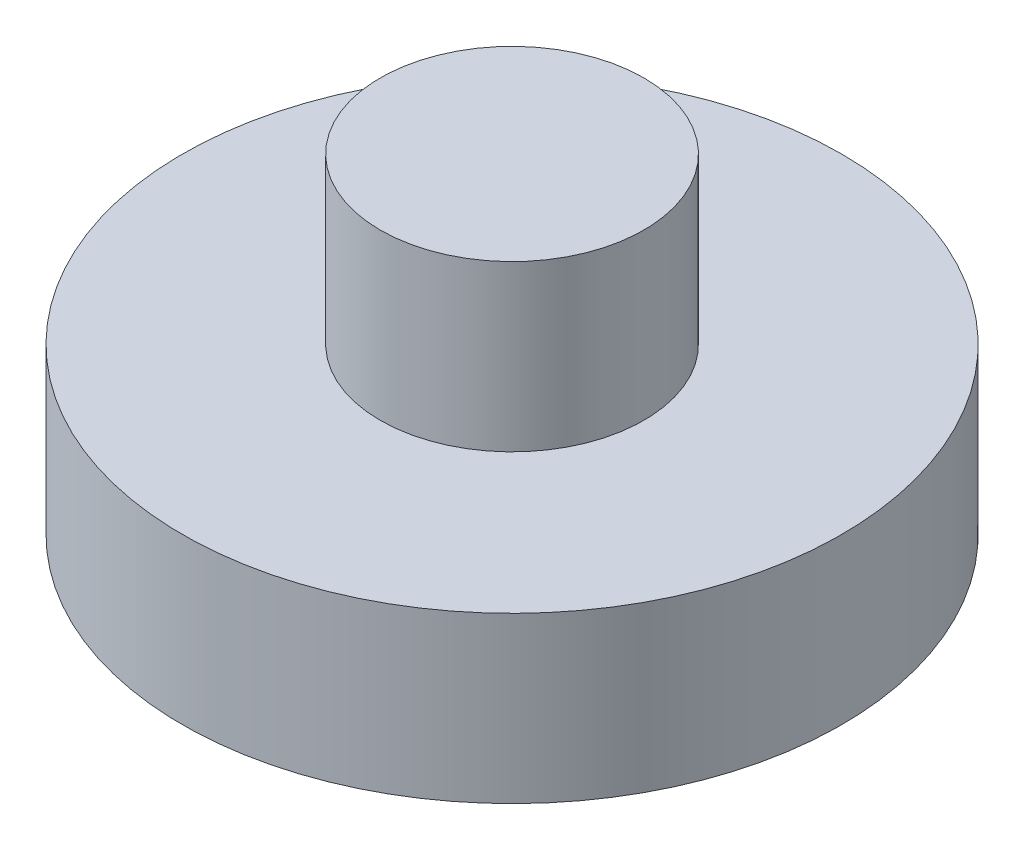
ISO-10303-21;
HEADER;
FILE_DESCRIPTION(('STEP AP214'),'2;1');
FILE_NAME('part.step','',(''),(''),'','','');
FILE_SCHEMA(('AUTOMOTIVE_DESIGN { 1 0 10303 214 1 1 1 1 }'));
ENDSEC;
DATA;
#1=APPLICATION_CONTEXT('core data for automotive mechanical design processes');
#2=APPLICATION_PROTOCOL_DEFINITION('international standard','automotive_design',2000,#1);
#3=PRODUCT_CONTEXT('',#1,'mechanical');
#4=PRODUCT('Part','Part','',(#3));
#5=PRODUCT_RELATED_PRODUCT_CATEGORY('part','',(#4));
#6=PRODUCT_DEFINITION_FORMATION('','',#4);
#7=PRODUCT_DEFINITION_CONTEXT('part definition',#1,'design');
#8=PRODUCT_DEFINITION('design','',#6,#7);
#9=PRODUCT_DEFINITION_SHAPE('','',#8);
#10=(LENGTH_UNIT() NAMED_UNIT(*) SI_UNIT(.MILLI.,.METRE.));
#11=(NAMED_UNIT(*) PLANE_ANGLE_UNIT() SI_UNIT($,.RADIAN.));
#12=(NAMED_UNIT(*) SI_UNIT($,.STERADIAN.) SOLID_ANGLE_UNIT());
#13=UNCERTAINTY_MEASURE_WITH_UNIT(LENGTH_MEASURE(1.E-05),#10,'distance_accuracy_value','');
#14=(GEOMETRIC_REPRESENTATION_CONTEXT(3) GLOBAL_UNCERTAINTY_ASSIGNED_CONTEXT((#13)) GLOBAL_UNIT_ASSIGNED_CONTEXT((#10,
#11,#12)) REPRESENTATION_CONTEXT('',''));
#15=CARTESIAN_POINT('',(0.,0.,0.));
#16=DIRECTION('',(0.,0.,1.));
#17=DIRECTION('',(1.,0.,0.));
#18=AXIS2_PLACEMENT_3D('',#15,#16,#17);
#19=CARTESIAN_POINT('',(12.7,0.,0.));
#20=DIRECTION('',(0.,-1.,0.));
#21=DIRECTION('',(0.,0.,-1.));
#22=AXIS2_PLACEMENT_3D('',#19,#20,#21);
#23=PLANE('',#22);
#24=CARTESIAN_POINT('',(0.,0.,0.));
#25=DIRECTION('',(0.,-1.,0.));
#26=DIRECTION('',(0.,0.,-1.));
#27=AXIS2_PLACEMENT_3D('',#24,#25,#26);
#28=CIRCLE('',#27,12.7);
#29=CARTESIAN_POINT('',(0.,0.,-12.7));
#30=VERTEX_POINT('',#29);
#31=EDGE_CURVE('E49',#30,#30,#28,.T.);
#32=ORIENTED_EDGE('',*,*,#31,.T.);
#33=EDGE_LOOP('',(#32));
#34=FACE_BOUND('',#33,.T.);
#35=ADVANCED_FACE('F35',(#34),#23,.T.);
#36=CARTESIAN_POINT('',(0.,12.7,0.));
#37=DIRECTION('',(0.,1.,0.));
#38=DIRECTION('',(0.,0.,1.));
#39=AXIS2_PLACEMENT_3D('',#36,#37,#38);
#40=PLANE('',#39);
#41=CARTESIAN_POINT('',(0.,12.7,0.));
#42=DIRECTION('',(0.,-1.,0.));
#43=DIRECTION('',(0.,0.,-1.));
#44=AXIS2_PLACEMENT_3D('',#41,#42,#43);
#45=CIRCLE('',#44,5.08);
#46=CARTESIAN_POINT('',(0.,12.7,-5.08));
#47=VERTEX_POINT('',#46);
#48=EDGE_CURVE('E10',#47,#47,#45,.T.);
#49=ORIENTED_EDGE('',*,*,#48,.F.);
#50=EDGE_LOOP('',(#49));
#51=FACE_BOUND('',#50,.T.);
#52=ADVANCED_FACE('F68',(#51),#40,.T.);
#53=CARTESIAN_POINT('',(0.,0.,0.));
#54=DIRECTION('',(0.,-1.,0.));
#55=DIRECTION('',(0.,0.,-1.));
#56=AXIS2_PLACEMENT_3D('',#53,#54,#55);
#57=CYLINDRICAL_SURFACE('',#56,5.08);
#58=ORIENTED_EDGE('',*,*,#48,.T.);
#59=EDGE_LOOP('',(#58));
#60=FACE_BOUND('',#59,.T.);
#61=CARTESIAN_POINT('',(0.,6.35,0.));
#62=DIRECTION('',(0.,-1.,0.));
#63=DIRECTION('',(0.,0.,-1.));
#64=AXIS2_PLACEMENT_3D('',#61,#62,#63);
#65=CIRCLE('',#64,5.08);
#66=CARTESIAN_POINT('',(0.,6.35,-5.08));
#67=VERTEX_POINT('',#66);
#68=EDGE_CURVE('E41',#67,#67,#65,.T.);
#69=ORIENTED_EDGE('',*,*,#68,.F.);
#70=EDGE_LOOP('',(#69));
#71=FACE_BOUND('',#70,.T.);
#72=ADVANCED_FACE('F65',(#60,#71),#57,.T.);
#73=CARTESIAN_POINT('',(5.08,6.35,0.));
#74=DIRECTION('',(0.,1.,0.));
#75=DIRECTION('',(0.,0.,1.));
#76=AXIS2_PLACEMENT_3D('',#73,#74,#75);
#77=PLANE('',#76);
#78=ORIENTED_EDGE('',*,*,#68,.T.);
#79=EDGE_LOOP('',(#78));
#80=FACE_BOUND('',#79,.T.);
#81=CARTESIAN_POINT('',(0.,6.35,0.));
#82=DIRECTION('',(0.,-1.,0.));
#83=DIRECTION('',(0.,0.,-1.));
#84=AXIS2_PLACEMENT_3D('',#81,#82,#83);
#85=CIRCLE('',#84,12.7);
#86=CARTESIAN_POINT('',(0.,6.35,-12.7));
#87=VERTEX_POINT('',#86);
#88=EDGE_CURVE('E45',#87,#87,#85,.T.);
#89=ORIENTED_EDGE('',*,*,#88,.F.);
#90=EDGE_LOOP('',(#89));
#91=FACE_BOUND('',#90,.T.);
#92=ADVANCED_FACE('F59',(#80,#91),#77,.T.);
#93=CARTESIAN_POINT('',(0.,0.,0.));
#94=DIRECTION('',(0.,-1.,0.));
#95=DIRECTION('',(0.,0.,-1.));
#96=AXIS2_PLACEMENT_3D('',#93,#94,#95);
#97=CYLINDRICAL_SURFACE('',#96,12.7);
#98=ORIENTED_EDGE('',*,*,#88,.T.);
#99=EDGE_LOOP('',(#98));
#100=FACE_BOUND('',#99,.T.);
#101=ORIENTED_EDGE('',*,*,#31,.F.);
#102=EDGE_LOOP('',(#101));
#103=FACE_BOUND('',#102,.T.);
#104=ADVANCED_FACE('F57',(#100,#103),#97,.T.);
#105=CLOSED_SHELL('',(#35,#52,#72,#92,#104));
#106=MANIFOLD_SOLID_BREP('B2',#105);
#107=ADVANCED_BREP_SHAPE_REPRESENTATION('',(#18,#106),#14);
#108=SHAPE_DEFINITION_REPRESENTATION(#9,#107);
ENDSEC;
END-ISO-10303-21;
